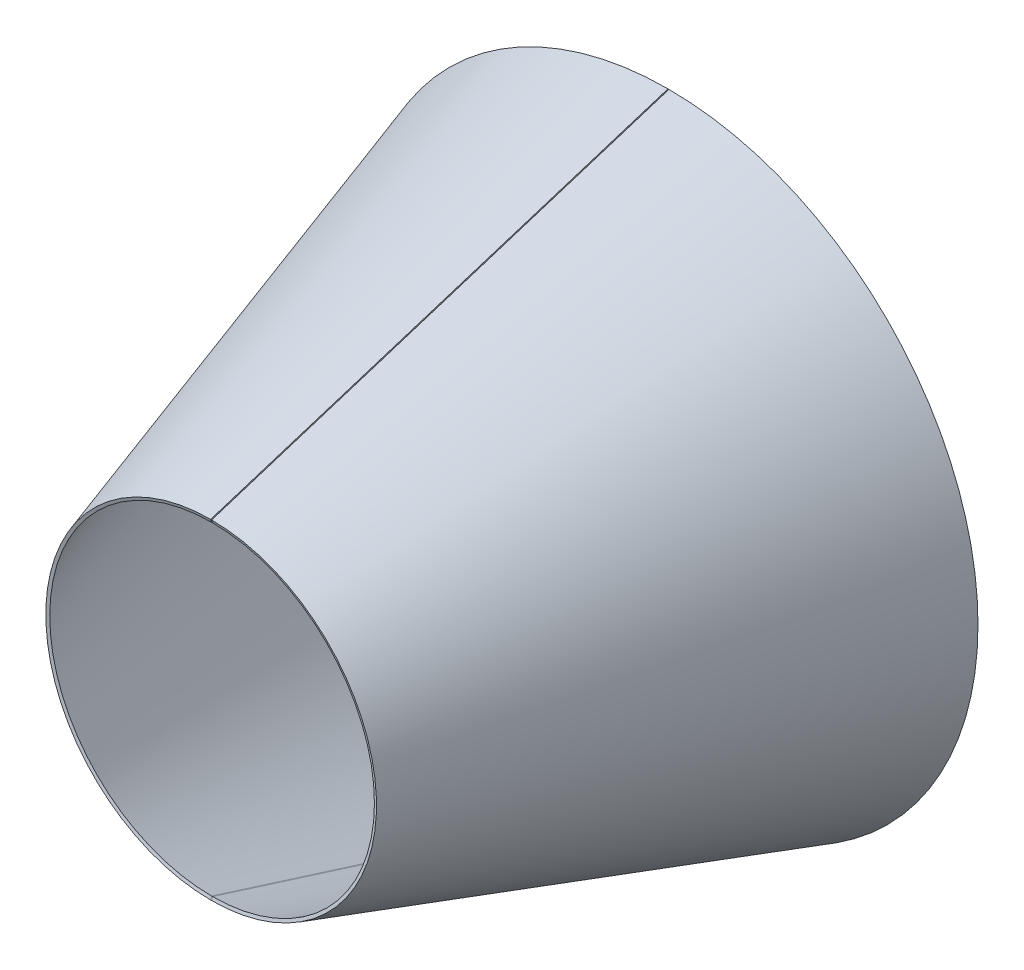
ISO-10303-21;
HEADER;
FILE_DESCRIPTION(('STEP AP214'),'2;1');
FILE_NAME('part.step','',(''),(''),'','','');
FILE_SCHEMA(('AUTOMOTIVE_DESIGN { 1 0 10303 214 1 1 1 1 }'));
ENDSEC;
DATA;
#1=APPLICATION_CONTEXT('core data for automotive mechanical design processes');
#2=APPLICATION_PROTOCOL_DEFINITION('international standard','automotive_design',2000,#1);
#3=PRODUCT_CONTEXT('',#1,'mechanical');
#4=PRODUCT('Part','Part','',(#3));
#5=PRODUCT_RELATED_PRODUCT_CATEGORY('part','',(#4));
#6=PRODUCT_DEFINITION_FORMATION('','',#4);
#7=PRODUCT_DEFINITION_CONTEXT('part definition',#1,'design');
#8=PRODUCT_DEFINITION('design','',#6,#7);
#9=PRODUCT_DEFINITION_SHAPE('','',#8);
#10=(LENGTH_UNIT() NAMED_UNIT(*) SI_UNIT(.MILLI.,.METRE.));
#11=(NAMED_UNIT(*) PLANE_ANGLE_UNIT() SI_UNIT($,.RADIAN.));
#12=(NAMED_UNIT(*) SI_UNIT($,.STERADIAN.) SOLID_ANGLE_UNIT());
#13=UNCERTAINTY_MEASURE_WITH_UNIT(LENGTH_MEASURE(1.E-05),#10,'distance_accuracy_value','');
#14=(GEOMETRIC_REPRESENTATION_CONTEXT(3) GLOBAL_UNCERTAINTY_ASSIGNED_CONTEXT((#13)) GLOBAL_UNIT_ASSIGNED_CONTEXT((#10,
#11,#12)) REPRESENTATION_CONTEXT('',''));
#15=CARTESIAN_POINT('',(0.,0.,0.));
#16=DIRECTION('',(0.,0.,1.));
#17=DIRECTION('',(1.,0.,0.));
#18=AXIS2_PLACEMENT_3D('',#15,#16,#17);
#19=CARTESIAN_POINT('',(0.254,-82.9416040336588,230.605451708607));
#20=DIRECTION('',(0.,0.953716950748229,-0.300705799504267));
#21=DIRECTION('',(0.,0.300705799504267,0.953716950748229));
#22=AXIS2_PLACEMENT_3D('',#19,#20,#21);
#23=PLANE('',#22);
#24=DIRECTION('',(0.,-0.300705799504267,-0.953716950748229));
#25=VECTOR('',#24,1.);
#26=CARTESIAN_POINT('',(-0.254,-82.9416040336588,230.605451708607));
#27=LINE('',#26,#25);
#28=CARTESIAN_POINT('',(-0.253999999999985,-82.9416040336588,230.605451708607));
#29=VERTEX_POINT('',#28);
#30=CARTESIAN_POINT('',(-0.254,-155.501913454038,0.473551493059332));
#31=VERTEX_POINT('',#30);
#32=EDGE_CURVE('E160',#29,#31,#27,.T.);
#33=ORIENTED_EDGE('',*,*,#32,.T.);
#34=DIRECTION('',(-1.,0.,0.));
#35=VECTOR('',#34,1.);
#36=CARTESIAN_POINT('',(0.254,-155.501913454038,0.473551493059332));
#37=LINE('',#36,#35);
#38=CARTESIAN_POINT('',(0.253999999999971,-155.501913454039,0.473551493059332));
#39=VERTEX_POINT('',#38);
#40=EDGE_CURVE('E163',#39,#31,#37,.T.);
#41=ORIENTED_EDGE('',*,*,#40,.F.);
#42=DIRECTION('',(0.,-0.300705799504267,-0.953716950748229));
#43=VECTOR('',#42,1.);
#44=CARTESIAN_POINT('',(0.254,-82.9416040336588,230.605451708607));
#45=LINE('',#44,#43);
#46=CARTESIAN_POINT('',(0.254,-82.9416040336588,230.605451708607));
#47=VERTEX_POINT('',#46);
#48=EDGE_CURVE('E62',#47,#39,#45,.T.);
#49=ORIENTED_EDGE('',*,*,#48,.F.);
#50=DIRECTION('',(-1.,0.,0.));
#51=VECTOR('',#50,1.);
#52=CARTESIAN_POINT('',(0.254,-82.9416040336588,230.605451708607));
#53=LINE('',#52,#51);
#54=EDGE_CURVE('E166',#47,#29,#53,.T.);
#55=ORIENTED_EDGE('',*,*,#54,.T.);
#56=EDGE_LOOP('',(#33,#41,#49,#55));
#57=FACE_BOUND('',#56,.T.);
#58=ADVANCED_FACE('F38',(#57),#23,.F.);
#59=CARTESIAN_POINT('',(0.254,378.825129825526,85.0109597782056));
#60=DIRECTION('',(0.,0.300705799504267,0.953716950748229));
#61=DIRECTION('',(0.,-0.953716950748229,0.300705799504267));
#62=AXIS2_PLACEMENT_3D('',#59,#60,#61);
#63=PLANE('',#62);
#64=ORIENTED_EDGE('',*,*,#54,.F.);
#65=DIRECTION('',(0.,-0.953716950748229,0.300705799504267));
#66=VECTOR('',#65,1.);
#67=CARTESIAN_POINT('',(0.254,378.825129825526,85.0109597782056));
#68=LINE('',#67,#66);
#69=CARTESIAN_POINT('',(0.254,-81.4396905796205,230.131900215548));
#70=VERTEX_POINT('',#69);
#71=EDGE_CURVE('E46',#70,#47,#68,.T.);
#72=ORIENTED_EDGE('',*,*,#71,.F.);
#73=DIRECTION('',(-1.,0.,0.));
#74=VECTOR('',#73,1.);
#75=CARTESIAN_POINT('',(0.254,-81.4396905796205,230.131900215548));
#76=LINE('',#75,#74);
#77=CARTESIAN_POINT('',(-0.253999999999985,-81.4396905796206,230.131900215547));
#78=VERTEX_POINT('',#77);
#79=EDGE_CURVE('E171',#70,#78,#76,.T.);
#80=ORIENTED_EDGE('',*,*,#79,.T.);
#81=DIRECTION('',(0.,-0.953716950748229,0.300705799504267));
#82=VECTOR('',#81,1.);
#83=CARTESIAN_POINT('',(-0.254,378.825129825526,85.0109597782056));
#84=LINE('',#83,#82);
#85=EDGE_CURVE('E11',#78,#29,#84,.T.);
#86=ORIENTED_EDGE('',*,*,#85,.T.);
#87=EDGE_LOOP('',(#64,#72,#80,#86));
#88=FACE_BOUND('',#87,.T.);
#89=ADVANCED_FACE('F40',(#88),#63,.T.);
#90=CARTESIAN_POINT('',(0.254,306.264820405146,-145.120940437342));
#91=DIRECTION('',(0.,0.300705799504267,0.953716950748229));
#92=DIRECTION('',(0.,-0.953716950748229,0.300705799504267));
#93=AXIS2_PLACEMENT_3D('',#90,#91,#92);
#94=PLANE('',#93);
#95=DIRECTION('',(0.,-0.953716950748229,0.300705799504267));
#96=VECTOR('',#95,1.);
#97=CARTESIAN_POINT('',(0.254,306.264820405146,-145.120940437342));
#98=LINE('',#97,#96);
#99=CARTESIAN_POINT('',(0.254,-154.,0.));
#100=VERTEX_POINT('',#99);
#101=EDGE_CURVE('E178',#100,#39,#98,.T.);
#102=ORIENTED_EDGE('',*,*,#101,.T.);
#103=ORIENTED_EDGE('',*,*,#40,.T.);
#104=DIRECTION('',(0.,-0.953716950748229,0.300705799504267));
#105=VECTOR('',#104,1.);
#106=CARTESIAN_POINT('',(-0.254,306.264820405146,-145.120940437342));
#107=LINE('',#106,#105);
#108=CARTESIAN_POINT('',(-0.254000000000028,-154.,3.33066907387547E-13));
#109=VERTEX_POINT('',#108);
#110=EDGE_CURVE('E126',#109,#31,#107,.T.);
#111=ORIENTED_EDGE('',*,*,#110,.F.);
#112=DIRECTION('',(-1.,0.,0.));
#113=VECTOR('',#112,1.);
#114=CARTESIAN_POINT('',(0.254,-154.,0.));
#115=LINE('',#114,#113);
#116=EDGE_CURVE('E53',#100,#109,#115,.T.);
#117=ORIENTED_EDGE('',*,*,#116,.F.);
#118=EDGE_LOOP('',(#102,#103,#111,#117));
#119=FACE_BOUND('',#118,.T.);
#120=ADVANCED_FACE('F203',(#119),#94,.F.);
#121=CARTESIAN_POINT('',(0.254,-81.4396905796205,230.131900215548));
#122=DIRECTION('',(0.,0.953716950748229,-0.300705799504267));
#123=DIRECTION('',(0.,0.300705799504267,0.953716950748229));
#124=AXIS2_PLACEMENT_3D('',#121,#122,#123);
#125=PLANE('',#124);
#126=DIRECTION('',(0.,-0.300705799504267,-0.953716950748229));
#127=VECTOR('',#126,1.);
#128=CARTESIAN_POINT('',(-0.254,-81.4396905796205,230.131900215548));
#129=LINE('',#128,#127);
#130=EDGE_CURVE('E168',#78,#109,#129,.T.);
#131=ORIENTED_EDGE('',*,*,#130,.F.);
#132=ORIENTED_EDGE('',*,*,#79,.F.);
#133=DIRECTION('',(0.,-0.300705799504267,-0.953716950748229));
#134=VECTOR('',#133,1.);
#135=CARTESIAN_POINT('',(0.254,-81.4396905796205,230.131900215548));
#136=LINE('',#135,#134);
#137=EDGE_CURVE('E174',#70,#100,#136,.T.);
#138=ORIENTED_EDGE('',*,*,#137,.T.);
#139=ORIENTED_EDGE('',*,*,#116,.T.);
#140=EDGE_LOOP('',(#131,#132,#138,#139));
#141=FACE_BOUND('',#140,.T.);
#142=ADVANCED_FACE('F200',(#141),#125,.T.);
#143=CARTESIAN_POINT('',(0.253999999996921,154.660841919777,0.208362656946182));
#144=DIRECTION('',(-1.,0.,0.));
#145=DIRECTION('',(0.,-0.300705799504266,0.953716950748229));
#146=AXIS2_PLACEMENT_3D('',#143,#144,#145);
#147=PLANE('',#146);
#148=DIRECTION('',(0.,-0.953716950748229,-0.300705799504267));
#149=VECTOR('',#148,1.);
#150=CARTESIAN_POINT('',(0.253999999998208,82.1005324993973,230.340262872494));
#151=LINE('',#150,#149);
#152=CARTESIAN_POINT('',(0.25399999999819,82.9416040336589,230.605451708607));
#153=VERTEX_POINT('',#152);
#154=CARTESIAN_POINT('',(0.253999999998223,81.4396905796206,230.131900215548));
#155=VERTEX_POINT('',#154);
#156=EDGE_CURVE('E158',#153,#155,#151,.T.);
#157=ORIENTED_EDGE('',*,*,#156,.F.);
#158=DIRECTION('',(0.,0.300705799504267,-0.953716950748229));
#159=VECTOR('',#158,1.);
#160=CARTESIAN_POINT('',(0.253999999979992,976.507238448011,-2603.42266997041));
#161=LINE('',#160,#159);
#162=CARTESIAN_POINT('',(0.253999999996904,155.501913454039,0.473551493059499));
#163=VERTEX_POINT('',#162);
#164=EDGE_CURVE('E152',#163,#153,#161,.F.);
#165=ORIENTED_EDGE('',*,*,#164,.F.);
#166=DIRECTION('',(0.,-0.953716950748229,-0.300705799504267));
#167=VECTOR('',#166,1.);
#168=CARTESIAN_POINT('',(0.253999999996921,154.660841919777,0.208362656946182));
#169=LINE('',#168,#167);
#170=CARTESIAN_POINT('',(0.253999999996934,154.,1.66533453693773E-13));
#171=VERTEX_POINT('',#170);
#172=EDGE_CURVE('E142',#163,#171,#169,.T.);
#173=ORIENTED_EDGE('',*,*,#172,.T.);
#174=DIRECTION('',(0.,0.300705799504267,-0.953716950748229));
#175=VECTOR('',#174,1.);
#176=CARTESIAN_POINT('',(0.253999999980023,975.005324993973,-2603.89622146347));
#177=LINE('',#176,#175);
#178=EDGE_CURVE('E143',#171,#155,#177,.F.);
#179=ORIENTED_EDGE('',*,*,#178,.T.);
#180=EDGE_LOOP('',(#157,#165,#173,#179));
#181=FACE_BOUND('',#180,.T.);
#182=ADVANCED_FACE('F192',(#181),#147,.T.);
#183=CARTESIAN_POINT('',(0.254,0.,0.208362656946015));
#184=DIRECTION('',(0.,0.,1.));
#185=DIRECTION('',(1.,0.,0.));
#186=AXIS2_PLACEMENT_3D('',#183,#184,#185);
#187=CONICAL_SURFACE('',#186,154.660841919777,1.2653637076959);
#188=ORIENTED_EDGE('',*,*,#172,.F.);
#189=CARTESIAN_POINT('',(0.254,0.,0.473551493059166));
#190=DIRECTION('',(0.,0.,-1.));
#191=DIRECTION('',(-1.,0.,0.));
#192=AXIS2_PLACEMENT_3D('',#189,#190,#191);
#193=CIRCLE('',#192,155.501913454039);
#194=EDGE_CURVE('E149',#39,#163,#193,.F.);
#195=ORIENTED_EDGE('',*,*,#194,.F.);
#196=ORIENTED_EDGE('',*,*,#101,.F.);
#197=CARTESIAN_POINT('',(0.254,0.,0.));
#198=DIRECTION('',(0.,0.,-1.));
#199=DIRECTION('',(-1.,0.,0.));
#200=AXIS2_PLACEMENT_3D('',#197,#198,#199);
#201=CIRCLE('',#200,154.);
#202=EDGE_CURVE('E139',#100,#171,#201,.F.);
#203=ORIENTED_EDGE('',*,*,#202,.T.);
#204=EDGE_LOOP('',(#188,#195,#196,#203));
#205=FACE_BOUND('',#204,.T.);
#206=ADVANCED_FACE('F202',(#205),#187,.T.);
#207=CARTESIAN_POINT('',(0.254,0.,230.340262872494));
#208=DIRECTION('',(0.,0.,1.));
#209=DIRECTION('',(1.,0.,0.));
#210=AXIS2_PLACEMENT_3D('',#207,#208,#209);
#211=CONICAL_SURFACE('',#210,82.1005324993973,1.2653637076959);
#212=CARTESIAN_POINT('',(0.254,0.,230.605451708607));
#213=DIRECTION('',(0.,0.,-1.));
#214=DIRECTION('',(-1.,0.,0.));
#215=AXIS2_PLACEMENT_3D('',#212,#213,#214);
#216=CIRCLE('',#215,82.9416040336588);
#217=EDGE_CURVE('E138',#153,#47,#216,.T.);
#218=ORIENTED_EDGE('',*,*,#217,.F.);
#219=ORIENTED_EDGE('',*,*,#156,.T.);
#220=CARTESIAN_POINT('',(0.254,0.,230.131900215548));
#221=DIRECTION('',(0.,0.,-1.));
#222=DIRECTION('',(-1.,0.,0.));
#223=AXIS2_PLACEMENT_3D('',#220,#221,#222);
#224=CIRCLE('',#223,81.4396905796204);
#225=EDGE_CURVE('E146',#155,#70,#224,.T.);
#226=ORIENTED_EDGE('',*,*,#225,.T.);
#227=ORIENTED_EDGE('',*,*,#71,.T.);
#228=EDGE_LOOP('',(#218,#219,#226,#227));
#229=FACE_BOUND('',#228,.T.);
#230=ADVANCED_FACE('F182',(#229),#211,.F.);
#231=CARTESIAN_POINT('',(0.254,0.,-2603.89622146347));
#232=DIRECTION('',(0.,0.,-1.));
#233=DIRECTION('',(-1.,0.,0.));
#234=AXIS2_PLACEMENT_3D('',#231,#232,#233);
#235=CONICAL_SURFACE('',#234,975.005324993973,0.305432619099001);
#236=ORIENTED_EDGE('',*,*,#137,.F.);
#237=ORIENTED_EDGE('',*,*,#225,.F.);
#238=ORIENTED_EDGE('',*,*,#178,.F.);
#239=ORIENTED_EDGE('',*,*,#202,.F.);
#240=EDGE_LOOP('',(#236,#237,#238,#239));
#241=FACE_BOUND('',#240,.T.);
#242=ADVANCED_FACE('F195',(#241),#235,.F.);
#243=CARTESIAN_POINT('',(0.254,0.,-2603.42266997041));
#244=DIRECTION('',(0.,0.,-1.));
#245=DIRECTION('',(-1.,0.,0.));
#246=AXIS2_PLACEMENT_3D('',#243,#244,#245);
#247=CONICAL_SURFACE('',#246,976.507238448011,0.305432619099001);
#248=ORIENTED_EDGE('',*,*,#48,.T.);
#249=ORIENTED_EDGE('',*,*,#194,.T.);
#250=ORIENTED_EDGE('',*,*,#164,.T.);
#251=ORIENTED_EDGE('',*,*,#217,.T.);
#252=EDGE_LOOP('',(#248,#249,#250,#251));
#253=FACE_BOUND('',#252,.T.);
#254=ADVANCED_FACE('F188',(#253),#247,.T.);
#255=CARTESIAN_POINT('',(-0.253999999998523,82.1005324993973,230.340262872494));
#256=DIRECTION('',(1.,0.,0.));
#257=DIRECTION('',(0.,0.300705799504266,-0.953716950748229));
#258=AXIS2_PLACEMENT_3D('',#255,#256,#257);
#259=PLANE('',#258);
#260=DIRECTION('',(0.,0.953716950748229,0.300705799504267));
#261=VECTOR('',#260,1.);
#262=CARTESIAN_POINT('',(-0.253999999998523,82.1005324993973,230.340262872494));
#263=LINE('',#262,#261);
#264=CARTESIAN_POINT('',(-0.253999999998534,81.4396905796204,230.131900215548));
#265=VERTEX_POINT('',#264);
#266=CARTESIAN_POINT('',(-0.253999999998507,82.9416040336586,230.605451708607));
#267=VERTEX_POINT('',#266);
#268=EDGE_CURVE('E115',#265,#267,#263,.T.);
#269=ORIENTED_EDGE('',*,*,#268,.F.);
#270=DIRECTION('',(0.,0.300705799504267,-0.953716950748229));
#271=VECTOR('',#270,1.);
#272=CARTESIAN_POINT('',(-0.253999999980792,975.005324993973,-2603.89622146347));
#273=LINE('',#272,#271);
#274=CARTESIAN_POINT('',(-0.25399999999681,154.,3.33066907387547E-13));
#275=VERTEX_POINT('',#274);
#276=EDGE_CURVE('E111',#265,#275,#273,.T.);
#277=ORIENTED_EDGE('',*,*,#276,.T.);
#278=DIRECTION('',(0.,0.953716950748229,0.300705799504267));
#279=VECTOR('',#278,1.);
#280=CARTESIAN_POINT('',(-0.253999999996797,154.660841919777,0.208362656946459));
#281=LINE('',#280,#279);
#282=CARTESIAN_POINT('',(-0.253999999996779,155.501913454038,0.473551493059665));
#283=VERTEX_POINT('',#282);
#284=EDGE_CURVE('E106',#275,#283,#281,.T.);
#285=ORIENTED_EDGE('',*,*,#284,.T.);
#286=DIRECTION('',(0.,0.300705799504267,-0.953716950748229));
#287=VECTOR('',#286,1.);
#288=CARTESIAN_POINT('',(-0.253999999980762,976.507238448011,-2603.42266997041));
#289=LINE('',#288,#287);
#290=EDGE_CURVE('E109',#267,#283,#289,.T.);
#291=ORIENTED_EDGE('',*,*,#290,.F.);
#292=EDGE_LOOP('',(#269,#277,#285,#291));
#293=FACE_BOUND('',#292,.T.);
#294=ADVANCED_FACE('F108',(#293),#259,.T.);
#295=CARTESIAN_POINT('',(-0.254,0.,0.208362656946459));
#296=DIRECTION('',(0.,0.,1.));
#297=DIRECTION('',(1.,0.,0.));
#298=AXIS2_PLACEMENT_3D('',#295,#296,#297);
#299=CONICAL_SURFACE('',#298,154.660841919777,1.2653637076959);
#300=ORIENTED_EDGE('',*,*,#284,.F.);
#301=CARTESIAN_POINT('',(-0.254,0.,4.44089209850063E-13));
#302=DIRECTION('',(0.,0.,-1.));
#303=DIRECTION('',(-1.,0.,0.));
#304=AXIS2_PLACEMENT_3D('',#301,#302,#303);
#305=CIRCLE('',#304,154.);
#306=EDGE_CURVE('E134',#275,#109,#305,.F.);
#307=ORIENTED_EDGE('',*,*,#306,.T.);
#308=ORIENTED_EDGE('',*,*,#110,.T.);
#309=CARTESIAN_POINT('',(-0.254,0.,0.47355149305961));
#310=DIRECTION('',(0.,0.,-1.));
#311=DIRECTION('',(-1.,0.,0.));
#312=AXIS2_PLACEMENT_3D('',#309,#310,#311);
#313=CIRCLE('',#312,155.501913454038);
#314=EDGE_CURVE('E122',#283,#31,#313,.F.);
#315=ORIENTED_EDGE('',*,*,#314,.F.);
#316=EDGE_LOOP('',(#300,#307,#308,#315));
#317=FACE_BOUND('',#316,.T.);
#318=ADVANCED_FACE('F125',(#317),#299,.T.);
#319=CARTESIAN_POINT('',(-0.254,0.,230.340262872493));
#320=DIRECTION('',(0.,0.,1.));
#321=DIRECTION('',(1.,0.,0.));
#322=AXIS2_PLACEMENT_3D('',#319,#320,#321);
#323=CONICAL_SURFACE('',#322,82.1005324993973,1.2653637076959);
#324=CARTESIAN_POINT('',(-0.254,0.,230.131900215547));
#325=DIRECTION('',(0.,0.,-1.));
#326=DIRECTION('',(-1.,0.,0.));
#327=AXIS2_PLACEMENT_3D('',#324,#325,#326);
#328=CIRCLE('',#327,81.4396905796204);
#329=EDGE_CURVE('E128',#78,#265,#328,.T.);
#330=ORIENTED_EDGE('',*,*,#329,.T.);
#331=ORIENTED_EDGE('',*,*,#268,.T.);
#332=CARTESIAN_POINT('',(-0.254,0.,230.605451708607));
#333=DIRECTION('',(0.,0.,-1.));
#334=DIRECTION('',(-1.,0.,0.));
#335=AXIS2_PLACEMENT_3D('',#332,#333,#334);
#336=CIRCLE('',#335,82.9416040336587);
#337=EDGE_CURVE('E116',#29,#267,#336,.T.);
#338=ORIENTED_EDGE('',*,*,#337,.F.);
#339=ORIENTED_EDGE('',*,*,#85,.F.);
#340=EDGE_LOOP('',(#330,#331,#338,#339));
#341=FACE_BOUND('',#340,.T.);
#342=ADVANCED_FACE('F206',(#341),#323,.F.);
#343=CARTESIAN_POINT('',(-0.254,0.,-2603.42266997041));
#344=DIRECTION('',(0.,0.,-1.));
#345=DIRECTION('',(-1.,0.,0.));
#346=AXIS2_PLACEMENT_3D('',#343,#344,#345);
#347=CONICAL_SURFACE('',#346,976.507238448011,0.305432619099001);
#348=ORIENTED_EDGE('',*,*,#32,.F.);
#349=ORIENTED_EDGE('',*,*,#337,.T.);
#350=ORIENTED_EDGE('',*,*,#290,.T.);
#351=ORIENTED_EDGE('',*,*,#314,.T.);
#352=EDGE_LOOP('',(#348,#349,#350,#351));
#353=FACE_BOUND('',#352,.T.);
#354=ADVANCED_FACE('F121',(#353),#347,.T.);
#355=CARTESIAN_POINT('',(-0.254,0.,-2603.89622146347));
#356=DIRECTION('',(0.,0.,-1.));
#357=DIRECTION('',(-1.,0.,0.));
#358=AXIS2_PLACEMENT_3D('',#355,#356,#357);
#359=CONICAL_SURFACE('',#358,975.005324993973,0.305432619099001);
#360=ORIENTED_EDGE('',*,*,#130,.T.);
#361=ORIENTED_EDGE('',*,*,#306,.F.);
#362=ORIENTED_EDGE('',*,*,#276,.F.);
#363=ORIENTED_EDGE('',*,*,#329,.F.);
#364=EDGE_LOOP('',(#360,#361,#362,#363));
#365=FACE_BOUND('',#364,.T.);
#366=ADVANCED_FACE('F208',(#365),#359,.F.);
#367=CLOSED_SHELL('',(#58,#89,#120,#142,#182,#206,#230,#242,#254,#294,#318,#342,#354,#366));
#368=MANIFOLD_SOLID_BREP('B2',#367);
#369=ADVANCED_BREP_SHAPE_REPRESENTATION('',(#18,#368),#14);
#370=SHAPE_DEFINITION_REPRESENTATION(#9,#369);
ENDSEC;
END-ISO-10303-21;
